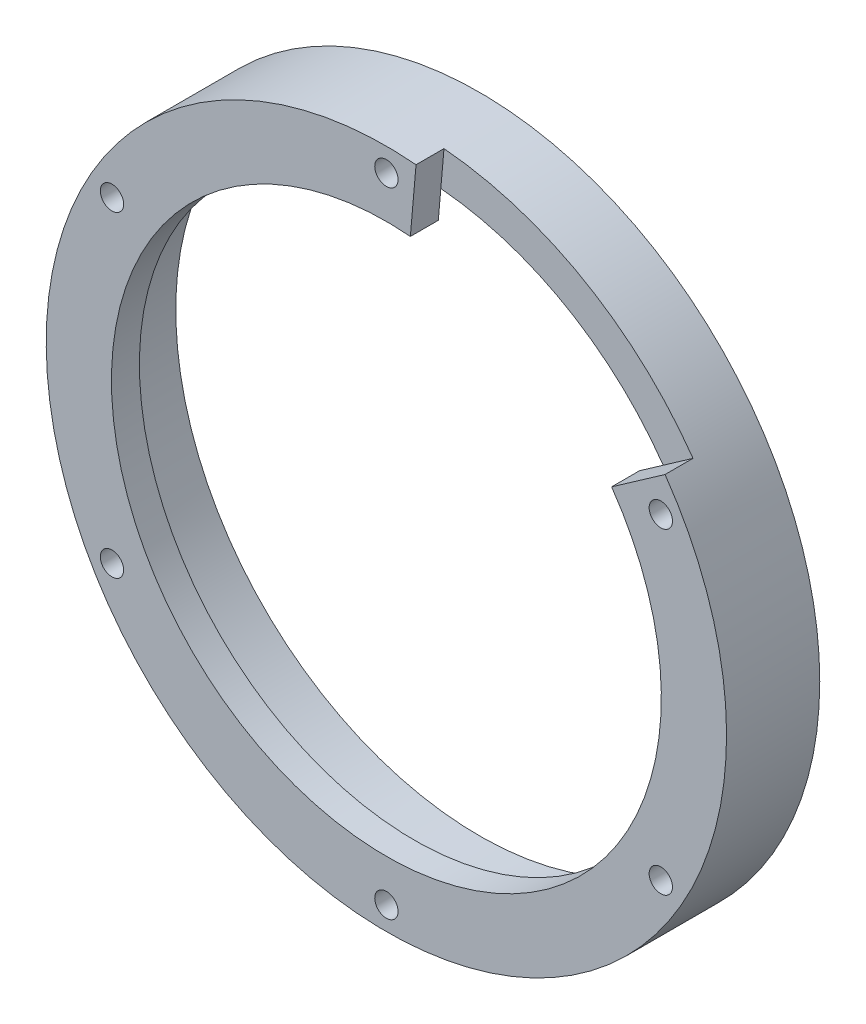
ISO-10303-21;
HEADER;
FILE_DESCRIPTION(('STEP AP214'),'2;1');
FILE_NAME('part.step','',(''),(''),'','','');
FILE_SCHEMA(('AUTOMOTIVE_DESIGN { 1 0 10303 214 1 1 1 1 }'));
ENDSEC;
DATA;
#1=APPLICATION_CONTEXT('core data for automotive mechanical design processes');
#2=APPLICATION_PROTOCOL_DEFINITION('international standard','automotive_design',2000,#1);
#3=PRODUCT_CONTEXT('',#1,'mechanical');
#4=PRODUCT('Part','Part','',(#3));
#5=PRODUCT_RELATED_PRODUCT_CATEGORY('part','',(#4));
#6=PRODUCT_DEFINITION_FORMATION('','',#4);
#7=PRODUCT_DEFINITION_CONTEXT('part definition',#1,'design');
#8=PRODUCT_DEFINITION('design','',#6,#7);
#9=PRODUCT_DEFINITION_SHAPE('','',#8);
#10=(LENGTH_UNIT() NAMED_UNIT(*) SI_UNIT(.MILLI.,.METRE.));
#11=(NAMED_UNIT(*) PLANE_ANGLE_UNIT() SI_UNIT($,.RADIAN.));
#12=(NAMED_UNIT(*) SI_UNIT($,.STERADIAN.) SOLID_ANGLE_UNIT());
#13=UNCERTAINTY_MEASURE_WITH_UNIT(LENGTH_MEASURE(1.E-05),#10,'distance_accuracy_value','');
#14=(GEOMETRIC_REPRESENTATION_CONTEXT(3) GLOBAL_UNCERTAINTY_ASSIGNED_CONTEXT((#13)) GLOBAL_UNIT_ASSIGNED_CONTEXT((#10,
#11,#12)) REPRESENTATION_CONTEXT('',''));
#15=CARTESIAN_POINT('',(0.,0.,0.));
#16=DIRECTION('',(0.,0.,1.));
#17=DIRECTION('',(1.,0.,0.));
#18=AXIS2_PLACEMENT_3D('',#15,#16,#17);
#19=CARTESIAN_POINT('',(0.,0.,6.5));
#20=DIRECTION('',(0.,0.,-1.));
#21=DIRECTION('',(-1.,0.,0.));
#22=AXIS2_PLACEMENT_3D('',#19,#20,#21);
#23=CYLINDRICAL_SURFACE('',#22,29.5);
#24=CARTESIAN_POINT('',(0.,0.,3.5));
#25=DIRECTION('',(0.,0.,1.));
#26=DIRECTION('',(1.,0.,0.));
#27=AXIS2_PLACEMENT_3D('',#24,#25,#26);
#28=CIRCLE('',#27,29.5);
#29=CARTESIAN_POINT('',(2.57109441105592,29.3877435937065,3.5));
#30=VERTEX_POINT('',#29);
#31=CARTESIAN_POINT('',(24.1649853065252,16.920504872356,3.5));
#32=VERTEX_POINT('',#31);
#33=EDGE_CURVE('E102',#30,#32,#28,.T.);
#34=ORIENTED_EDGE('',*,*,#33,.F.);
#35=DIRECTION('',(0.,0.,1.));
#36=VECTOR('',#35,1.);
#37=CARTESIAN_POINT('',(2.57109441105592,29.3877435937065,3.5));
#38=LINE('',#37,#36);
#39=CARTESIAN_POINT('',(2.57109441105592,29.3877435937065,6.5));
#40=VERTEX_POINT('',#39);
#41=EDGE_CURVE('E185',#30,#40,#38,.T.);
#42=ORIENTED_EDGE('',*,*,#41,.T.);
#43=CARTESIAN_POINT('',(0.,0.,6.5));
#44=DIRECTION('',(0.,0.,1.));
#45=DIRECTION('',(1.,0.,0.));
#46=AXIS2_PLACEMENT_3D('',#43,#44,#45);
#47=CIRCLE('',#46,29.5);
#48=CARTESIAN_POINT('',(24.1649853065252,16.920504872356,6.5));
#49=VERTEX_POINT('',#48);
#50=EDGE_CURVE('E110',#40,#49,#47,.T.);
#51=ORIENTED_EDGE('',*,*,#50,.T.);
#52=DIRECTION('',(0.,0.,1.));
#53=VECTOR('',#52,1.);
#54=CARTESIAN_POINT('',(24.1649853065252,16.920504872356,3.5));
#55=LINE('',#54,#53);
#56=EDGE_CURVE('E91',#32,#49,#55,.T.);
#57=ORIENTED_EDGE('',*,*,#56,.F.);
#58=EDGE_LOOP('',(#34,#42,#51,#57));
#59=FACE_BOUND('',#58,.T.);
#60=ADVANCED_FACE('F41',(#59),#23,.F.);
#61=CARTESIAN_POINT('',(0.,0.,-3.5));
#62=DIRECTION('',(0.,0.,1.));
#63=DIRECTION('',(1.,0.,0.));
#64=AXIS2_PLACEMENT_3D('',#61,#62,#63);
#65=PLANE('',#64);
#66=CARTESIAN_POINT('',(0.,34.,-3.5));
#67=DIRECTION('',(0.,0.,-1.));
#68=DIRECTION('',(-1.,0.,0.));
#69=AXIS2_PLACEMENT_3D('',#66,#67,#68);
#70=CIRCLE('',#69,1.25);
#71=CARTESIAN_POINT('',(-1.25,34.,-3.5));
#72=VERTEX_POINT('',#71);
#73=EDGE_CURVE('E128',#72,#72,#70,.T.);
#74=ORIENTED_EDGE('',*,*,#73,.F.);
#75=EDGE_LOOP('',(#74));
#76=FACE_BOUND('',#75,.T.);
#77=CARTESIAN_POINT('',(29.4448637286709,17.,-3.5));
#78=DIRECTION('',(0.,0.,-1.));
#79=DIRECTION('',(-1.,0.,0.));
#80=AXIS2_PLACEMENT_3D('',#77,#78,#79);
#81=CIRCLE('',#80,1.25);
#82=CARTESIAN_POINT('',(28.1948637286709,17.,-3.5));
#83=VERTEX_POINT('',#82);
#84=EDGE_CURVE('E172',#83,#83,#81,.T.);
#85=ORIENTED_EDGE('',*,*,#84,.F.);
#86=EDGE_LOOP('',(#85));
#87=FACE_BOUND('',#86,.T.);
#88=CARTESIAN_POINT('',(29.4448637286709,-17.,-3.5));
#89=DIRECTION('',(0.,0.,-1.));
#90=DIRECTION('',(-1.,0.,0.));
#91=AXIS2_PLACEMENT_3D('',#88,#89,#90);
#92=CIRCLE('',#91,1.25);
#93=CARTESIAN_POINT('',(28.1948637286709,-17.,-3.5));
#94=VERTEX_POINT('',#93);
#95=EDGE_CURVE('E180',#94,#94,#92,.T.);
#96=ORIENTED_EDGE('',*,*,#95,.F.);
#97=EDGE_LOOP('',(#96));
#98=FACE_BOUND('',#97,.T.);
#99=CARTESIAN_POINT('',(0.,-34.,-3.5));
#100=DIRECTION('',(0.,0.,-1.));
#101=DIRECTION('',(-1.,0.,0.));
#102=AXIS2_PLACEMENT_3D('',#99,#100,#101);
#103=CIRCLE('',#102,1.25);
#104=CARTESIAN_POINT('',(-1.25,-34.,-3.5));
#105=VERTEX_POINT('',#104);
#106=EDGE_CURVE('E171',#105,#105,#103,.T.);
#107=ORIENTED_EDGE('',*,*,#106,.F.);
#108=EDGE_LOOP('',(#107));
#109=FACE_BOUND('',#108,.T.);
#110=CARTESIAN_POINT('',(-29.4448637286709,-17.,-3.5));
#111=DIRECTION('',(0.,0.,-1.));
#112=DIRECTION('',(-1.,0.,0.));
#113=AXIS2_PLACEMENT_3D('',#110,#111,#112);
#114=CIRCLE('',#113,1.25);
#115=CARTESIAN_POINT('',(-30.6948637286709,-17.,-3.5));
#116=VERTEX_POINT('',#115);
#117=EDGE_CURVE('E168',#116,#116,#114,.T.);
#118=ORIENTED_EDGE('',*,*,#117,.F.);
#119=EDGE_LOOP('',(#118));
#120=FACE_BOUND('',#119,.T.);
#121=CARTESIAN_POINT('',(-29.4448637286709,17.,-3.5));
#122=DIRECTION('',(0.,0.,-1.));
#123=DIRECTION('',(-1.,0.,0.));
#124=AXIS2_PLACEMENT_3D('',#121,#122,#123);
#125=CIRCLE('',#124,1.25);
#126=CARTESIAN_POINT('',(-30.6948637286709,17.,-3.5));
#127=VERTEX_POINT('',#126);
#128=EDGE_CURVE('E165',#127,#127,#125,.T.);
#129=ORIENTED_EDGE('',*,*,#128,.F.);
#130=EDGE_LOOP('',(#129));
#131=FACE_BOUND('',#130,.T.);
#132=CARTESIAN_POINT('',(0.,0.,-3.5));
#133=DIRECTION('',(0.,0.,1.));
#134=DIRECTION('',(1.,0.,0.));
#135=AXIS2_PLACEMENT_3D('',#132,#133,#134);
#136=CIRCLE('',#135,36.5);
#137=CARTESIAN_POINT('',(36.5,0.,-3.5));
#138=VERTEX_POINT('',#137);
#139=EDGE_CURVE('E11',#138,#138,#136,.T.);
#140=ORIENTED_EDGE('',*,*,#139,.F.);
#141=EDGE_LOOP('',(#140));
#142=FACE_BOUND('',#141,.T.);
#143=CARTESIAN_POINT('',(0.,0.,-3.5));
#144=DIRECTION('',(0.,0.,1.));
#145=DIRECTION('',(1.,0.,0.));
#146=AXIS2_PLACEMENT_3D('',#143,#144,#145);
#147=CIRCLE('',#146,32.6);
#148=CARTESIAN_POINT('',(32.6,0.,-3.5));
#149=VERTEX_POINT('',#148);
#150=EDGE_CURVE('E49',#149,#149,#147,.T.);
#151=ORIENTED_EDGE('',*,*,#150,.T.);
#152=EDGE_LOOP('',(#151));
#153=FACE_BOUND('',#152,.T.);
#154=ADVANCED_FACE('F220',(#76,#87,#98,#109,#120,#131,#142,#153),#65,.F.);
#155=CARTESIAN_POINT('',(0.,0.,3.5));
#156=DIRECTION('',(0.,0.,-1.));
#157=DIRECTION('',(-1.,0.,0.));
#158=AXIS2_PLACEMENT_3D('',#155,#156,#157);
#159=CYLINDRICAL_SURFACE('',#158,36.5);
#160=CARTESIAN_POINT('',(0.,0.,3.5));
#161=DIRECTION('',(0.,0.,1.));
#162=DIRECTION('',(1.,0.,0.));
#163=AXIS2_PLACEMENT_3D('',#160,#161,#162);
#164=CIRCLE('',#163,36.5);
#165=CARTESIAN_POINT('',(29.8990496165481,20.9355399268134,3.5));
#166=VERTEX_POINT('',#165);
#167=CARTESIAN_POINT('',(3.18118461028953,36.3611064803487,3.5));
#168=VERTEX_POINT('',#167);
#169=EDGE_CURVE('E100',#166,#168,#164,.T.);
#170=ORIENTED_EDGE('',*,*,#169,.F.);
#171=DIRECTION('',(0.,0.,1.));
#172=VECTOR('',#171,1.);
#173=CARTESIAN_POINT('',(29.8990496165481,20.9355399268134,3.5));
#174=LINE('',#173,#172);
#175=CARTESIAN_POINT('',(29.8990496165481,20.9355399268134,6.5));
#176=VERTEX_POINT('',#175);
#177=EDGE_CURVE('E59',#166,#176,#174,.T.);
#178=ORIENTED_EDGE('',*,*,#177,.T.);
#179=CARTESIAN_POINT('',(0.,0.,6.5));
#180=DIRECTION('',(0.,0.,1.));
#181=DIRECTION('',(1.,0.,0.));
#182=AXIS2_PLACEMENT_3D('',#179,#180,#181);
#183=CIRCLE('',#182,36.5);
#184=CARTESIAN_POINT('',(3.18118461028953,36.3611064803487,6.5));
#185=VERTEX_POINT('',#184);
#186=EDGE_CURVE('E112',#185,#176,#183,.T.);
#187=ORIENTED_EDGE('',*,*,#186,.F.);
#188=DIRECTION('',(0.,0.,1.));
#189=VECTOR('',#188,1.);
#190=CARTESIAN_POINT('',(3.18118461028953,36.3611064803487,3.5));
#191=LINE('',#190,#189);
#192=EDGE_CURVE('E183',#168,#185,#191,.T.);
#193=ORIENTED_EDGE('',*,*,#192,.F.);
#194=EDGE_LOOP('',(#170,#178,#187,#193));
#195=FACE_BOUND('',#194,.T.);
#196=ORIENTED_EDGE('',*,*,#139,.T.);
#197=EDGE_LOOP('',(#196));
#198=FACE_BOUND('',#197,.T.);
#199=ADVANCED_FACE('F43',(#195,#198),#159,.T.);
#200=CARTESIAN_POINT('',(0.,0.,3.5));
#201=DIRECTION('',(0.,0.,-1.));
#202=DIRECTION('',(-1.,0.,0.));
#203=AXIS2_PLACEMENT_3D('',#200,#201,#202);
#204=CYLINDRICAL_SURFACE('',#203,32.6);
#205=CARTESIAN_POINT('',(0.,0.,3.5));
#206=DIRECTION('',(0.,0.,1.));
#207=DIRECTION('',(1.,0.,0.));
#208=AXIS2_PLACEMENT_3D('',#205,#206,#207);
#209=CIRCLE('',#208,32.6);
#210=CARTESIAN_POINT('',(26.704356643821,18.6985918250443,3.5));
#211=VERTEX_POINT('',#210);
#212=CARTESIAN_POINT('',(2.84127721357366,32.4759471577909,3.5));
#213=VERTEX_POINT('',#212);
#214=EDGE_CURVE('E63',#211,#213,#209,.T.);
#215=ORIENTED_EDGE('',*,*,#214,.T.);
#216=EDGE_CURVE('E125',#213,#211,#209,.T.);
#217=ORIENTED_EDGE('',*,*,#216,.T.);
#218=EDGE_LOOP('',(#215,#217));
#219=FACE_BOUND('',#218,.T.);
#220=ORIENTED_EDGE('',*,*,#150,.F.);
#221=EDGE_LOOP('',(#220));
#222=FACE_BOUND('',#221,.T.);
#223=ADVANCED_FACE('F229',(#219,#222),#204,.F.);
#224=CARTESIAN_POINT('',(0.,0.,3.5));
#225=DIRECTION('',(0.,0.,1.));
#226=DIRECTION('',(1.,0.,0.));
#227=AXIS2_PLACEMENT_3D('',#224,#225,#226);
#228=PLANE('',#227);
#229=ORIENTED_EDGE('',*,*,#216,.F.);
#230=DIRECTION('',(-0.0871557427476582,-0.996194698091746,0.));
#231=VECTOR('',#230,1.);
#232=CARTESIAN_POINT('',(0.,0.,3.5));
#233=LINE('',#232,#231);
#234=EDGE_CURVE('E115',#213,#30,#233,.T.);
#235=ORIENTED_EDGE('',*,*,#234,.T.);
#236=ORIENTED_EDGE('',*,*,#33,.T.);
#237=DIRECTION('',(0.819152044288989,0.573576436351051,0.));
#238=VECTOR('',#237,1.);
#239=CARTESIAN_POINT('',(0.,0.,3.5));
#240=LINE('',#239,#238);
#241=EDGE_CURVE('E88',#32,#211,#240,.T.);
#242=ORIENTED_EDGE('',*,*,#241,.T.);
#243=EDGE_LOOP('',(#229,#235,#236,#242));
#244=FACE_BOUND('',#243,.T.);
#245=ADVANCED_FACE('F111',(#244),#228,.F.);
#246=CARTESIAN_POINT('',(0.,0.,6.5));
#247=DIRECTION('',(0.,0.,1.));
#248=DIRECTION('',(1.,0.,0.));
#249=AXIS2_PLACEMENT_3D('',#246,#247,#248);
#250=PLANE('',#249);
#251=DIRECTION('',(0.819152044288989,0.573576436351051,0.));
#252=VECTOR('',#251,1.);
#253=CARTESIAN_POINT('',(0.,0.,6.5));
#254=LINE('',#253,#252);
#255=EDGE_CURVE('E197',#49,#176,#254,.T.);
#256=ORIENTED_EDGE('',*,*,#255,.F.);
#257=ORIENTED_EDGE('',*,*,#50,.F.);
#258=DIRECTION('',(-0.0871557427476582,-0.996194698091746,0.));
#259=VECTOR('',#258,1.);
#260=CARTESIAN_POINT('',(0.,0.,6.5));
#261=LINE('',#260,#259);
#262=EDGE_CURVE('E189',#185,#40,#261,.T.);
#263=ORIENTED_EDGE('',*,*,#262,.F.);
#264=ORIENTED_EDGE('',*,*,#186,.T.);
#265=EDGE_LOOP('',(#256,#257,#263,#264));
#266=FACE_BOUND('',#265,.T.);
#267=CARTESIAN_POINT('',(0.,34.,6.5));
#268=DIRECTION('',(0.,0.,1.));
#269=DIRECTION('',(1.,0.,0.));
#270=AXIS2_PLACEMENT_3D('',#267,#268,#269);
#271=CIRCLE('',#270,1.25);
#272=CARTESIAN_POINT('',(1.25,34.,6.5));
#273=VERTEX_POINT('',#272);
#274=EDGE_CURVE('E44',#273,#273,#271,.T.);
#275=ORIENTED_EDGE('',*,*,#274,.F.);
#276=EDGE_LOOP('',(#275));
#277=FACE_BOUND('',#276,.T.);
#278=CARTESIAN_POINT('',(29.4448637286709,17.,6.5));
#279=DIRECTION('',(0.,0.,1.));
#280=DIRECTION('',(1.,0.,0.));
#281=AXIS2_PLACEMENT_3D('',#278,#279,#280);
#282=CIRCLE('',#281,1.25);
#283=CARTESIAN_POINT('',(30.6948637286709,17.,6.5));
#284=VERTEX_POINT('',#283);
#285=EDGE_CURVE('E120',#284,#284,#282,.T.);
#286=ORIENTED_EDGE('',*,*,#285,.F.);
#287=EDGE_LOOP('',(#286));
#288=FACE_BOUND('',#287,.T.);
#289=CARTESIAN_POINT('',(29.4448637286709,-17.,6.5));
#290=DIRECTION('',(0.,0.,1.));
#291=DIRECTION('',(1.,0.,0.));
#292=AXIS2_PLACEMENT_3D('',#289,#290,#291);
#293=CIRCLE('',#292,1.25);
#294=CARTESIAN_POINT('',(30.6948637286709,-17.,6.5));
#295=VERTEX_POINT('',#294);
#296=EDGE_CURVE('E139',#295,#295,#293,.T.);
#297=ORIENTED_EDGE('',*,*,#296,.F.);
#298=EDGE_LOOP('',(#297));
#299=FACE_BOUND('',#298,.T.);
#300=CARTESIAN_POINT('',(0.,-34.,6.5));
#301=DIRECTION('',(0.,0.,1.));
#302=DIRECTION('',(1.,0.,0.));
#303=AXIS2_PLACEMENT_3D('',#300,#301,#302);
#304=CIRCLE('',#303,1.25);
#305=CARTESIAN_POINT('',(1.25,-34.,6.5));
#306=VERTEX_POINT('',#305);
#307=EDGE_CURVE('E132',#306,#306,#304,.T.);
#308=ORIENTED_EDGE('',*,*,#307,.F.);
#309=EDGE_LOOP('',(#308));
#310=FACE_BOUND('',#309,.T.);
#311=CARTESIAN_POINT('',(-29.4448637286709,-17.,6.5));
#312=DIRECTION('',(0.,0.,1.));
#313=DIRECTION('',(1.,0.,0.));
#314=AXIS2_PLACEMENT_3D('',#311,#312,#313);
#315=CIRCLE('',#314,1.25);
#316=CARTESIAN_POINT('',(-28.1948637286709,-17.,6.5));
#317=VERTEX_POINT('',#316);
#318=EDGE_CURVE('E126',#317,#317,#315,.T.);
#319=ORIENTED_EDGE('',*,*,#318,.F.);
#320=EDGE_LOOP('',(#319));
#321=FACE_BOUND('',#320,.T.);
#322=CARTESIAN_POINT('',(-29.4448637286709,17.,6.5));
#323=DIRECTION('',(0.,0.,1.));
#324=DIRECTION('',(1.,0.,0.));
#325=AXIS2_PLACEMENT_3D('',#322,#323,#324);
#326=CIRCLE('',#325,1.25);
#327=CARTESIAN_POINT('',(-28.1948637286709,17.,6.5));
#328=VERTEX_POINT('',#327);
#329=EDGE_CURVE('E127',#328,#328,#326,.T.);
#330=ORIENTED_EDGE('',*,*,#329,.F.);
#331=EDGE_LOOP('',(#330));
#332=FACE_BOUND('',#331,.T.);
#333=ADVANCED_FACE('F144',(#266,#277,#288,#299,#310,#321,#332),#250,.T.);
#334=CARTESIAN_POINT('',(-29.4448637286709,17.,16.5));
#335=DIRECTION('',(0.,0.,-1.));
#336=DIRECTION('',(-1.,0.,0.));
#337=AXIS2_PLACEMENT_3D('',#334,#335,#336);
#338=CYLINDRICAL_SURFACE('',#337,1.25);
#339=ORIENTED_EDGE('',*,*,#329,.T.);
#340=EDGE_LOOP('',(#339));
#341=FACE_BOUND('',#340,.T.);
#342=ORIENTED_EDGE('',*,*,#128,.T.);
#343=EDGE_LOOP('',(#342));
#344=FACE_BOUND('',#343,.T.);
#345=ADVANCED_FACE('F150',(#341,#344),#338,.F.);
#346=CARTESIAN_POINT('',(-29.4448637286709,-17.,16.5));
#347=DIRECTION('',(0.,0.,-1.));
#348=DIRECTION('',(-1.,0.,0.));
#349=AXIS2_PLACEMENT_3D('',#346,#347,#348);
#350=CYLINDRICAL_SURFACE('',#349,1.25);
#351=ORIENTED_EDGE('',*,*,#318,.T.);
#352=EDGE_LOOP('',(#351));
#353=FACE_BOUND('',#352,.T.);
#354=ORIENTED_EDGE('',*,*,#117,.T.);
#355=EDGE_LOOP('',(#354));
#356=FACE_BOUND('',#355,.T.);
#357=ADVANCED_FACE('F157',(#353,#356),#350,.F.);
#358=CARTESIAN_POINT('',(0.,-34.,16.5));
#359=DIRECTION('',(0.,0.,-1.));
#360=DIRECTION('',(-1.,0.,0.));
#361=AXIS2_PLACEMENT_3D('',#358,#359,#360);
#362=CYLINDRICAL_SURFACE('',#361,1.25);
#363=ORIENTED_EDGE('',*,*,#307,.T.);
#364=EDGE_LOOP('',(#363));
#365=FACE_BOUND('',#364,.T.);
#366=ORIENTED_EDGE('',*,*,#106,.T.);
#367=EDGE_LOOP('',(#366));
#368=FACE_BOUND('',#367,.T.);
#369=ADVANCED_FACE('F274',(#365,#368),#362,.F.);
#370=CARTESIAN_POINT('',(29.4448637286709,-17.,16.5));
#371=DIRECTION('',(0.,0.,-1.));
#372=DIRECTION('',(-1.,0.,0.));
#373=AXIS2_PLACEMENT_3D('',#370,#371,#372);
#374=CYLINDRICAL_SURFACE('',#373,1.25);
#375=ORIENTED_EDGE('',*,*,#296,.T.);
#376=EDGE_LOOP('',(#375));
#377=FACE_BOUND('',#376,.T.);
#378=ORIENTED_EDGE('',*,*,#95,.T.);
#379=EDGE_LOOP('',(#378));
#380=FACE_BOUND('',#379,.T.);
#381=ADVANCED_FACE('F222',(#377,#380),#374,.F.);
#382=CARTESIAN_POINT('',(29.4448637286709,17.,16.5));
#383=DIRECTION('',(0.,0.,-1.));
#384=DIRECTION('',(-1.,0.,0.));
#385=AXIS2_PLACEMENT_3D('',#382,#383,#384);
#386=CYLINDRICAL_SURFACE('',#385,1.25);
#387=ORIENTED_EDGE('',*,*,#285,.T.);
#388=EDGE_LOOP('',(#387));
#389=FACE_BOUND('',#388,.T.);
#390=ORIENTED_EDGE('',*,*,#84,.T.);
#391=EDGE_LOOP('',(#390));
#392=FACE_BOUND('',#391,.T.);
#393=ADVANCED_FACE('F142',(#389,#392),#386,.F.);
#394=CARTESIAN_POINT('',(0.,34.,16.5));
#395=DIRECTION('',(0.,0.,-1.));
#396=DIRECTION('',(-1.,0.,0.));
#397=AXIS2_PLACEMENT_3D('',#394,#395,#396);
#398=CYLINDRICAL_SURFACE('',#397,1.25);
#399=ORIENTED_EDGE('',*,*,#274,.T.);
#400=EDGE_LOOP('',(#399));
#401=FACE_BOUND('',#400,.T.);
#402=ORIENTED_EDGE('',*,*,#73,.T.);
#403=EDGE_LOOP('',(#402));
#404=FACE_BOUND('',#403,.T.);
#405=ADVANCED_FACE('F207',(#401,#404),#398,.F.);
#406=CARTESIAN_POINT('',(0.,0.,3.5));
#407=DIRECTION('',(-0.996194698091746,0.0871557427476582,0.));
#408=DIRECTION('',(-0.0871557427476582,-0.996194698091746,0.));
#409=AXIS2_PLACEMENT_3D('',#406,#407,#408);
#410=PLANE('',#409);
#411=ORIENTED_EDGE('',*,*,#262,.T.);
#412=ORIENTED_EDGE('',*,*,#41,.F.);
#413=ORIENTED_EDGE('',*,*,#234,.F.);
#414=EDGE_CURVE('E108',#168,#213,#233,.T.);
#415=ORIENTED_EDGE('',*,*,#414,.F.);
#416=ORIENTED_EDGE('',*,*,#192,.T.);
#417=EDGE_LOOP('',(#411,#412,#413,#415,#416));
#418=FACE_BOUND('',#417,.T.);
#419=ADVANCED_FACE('F203',(#418),#410,.F.);
#420=CARTESIAN_POINT('',(0.,0.,3.5));
#421=DIRECTION('',(0.573576436351051,-0.819152044288988,0.));
#422=DIRECTION('',(0.819152044288988,0.573576436351051,0.));
#423=AXIS2_PLACEMENT_3D('',#420,#421,#422);
#424=PLANE('',#423);
#425=ORIENTED_EDGE('',*,*,#255,.T.);
#426=ORIENTED_EDGE('',*,*,#177,.F.);
#427=EDGE_CURVE('E93',#211,#166,#240,.T.);
#428=ORIENTED_EDGE('',*,*,#427,.F.);
#429=ORIENTED_EDGE('',*,*,#241,.F.);
#430=ORIENTED_EDGE('',*,*,#56,.T.);
#431=EDGE_LOOP('',(#425,#426,#428,#429,#430));
#432=FACE_BOUND('',#431,.T.);
#433=ADVANCED_FACE('F94',(#432),#424,.F.);
#434=CARTESIAN_POINT('',(0.,0.,3.5));
#435=DIRECTION('',(0.,0.,1.));
#436=DIRECTION('',(1.,0.,0.));
#437=AXIS2_PLACEMENT_3D('',#434,#435,#436);
#438=PLANE('',#437);
#439=ORIENTED_EDGE('',*,*,#427,.T.);
#440=ORIENTED_EDGE('',*,*,#169,.T.);
#441=ORIENTED_EDGE('',*,*,#414,.T.);
#442=ORIENTED_EDGE('',*,*,#214,.F.);
#443=EDGE_LOOP('',(#439,#440,#441,#442));
#444=FACE_BOUND('',#443,.T.);
#445=ADVANCED_FACE('F205',(#444),#438,.T.);
#446=CLOSED_SHELL('',(#60,#154,#199,#223,#245,#333,#345,#357,#369,#381,#393,#405,#419,#433,#445));
#447=MANIFOLD_SOLID_BREP('B2',#446);
#448=ADVANCED_BREP_SHAPE_REPRESENTATION('',(#18,#447),#14);
#449=SHAPE_DEFINITION_REPRESENTATION(#9,#448);
ENDSEC;
END-ISO-10303-21;
